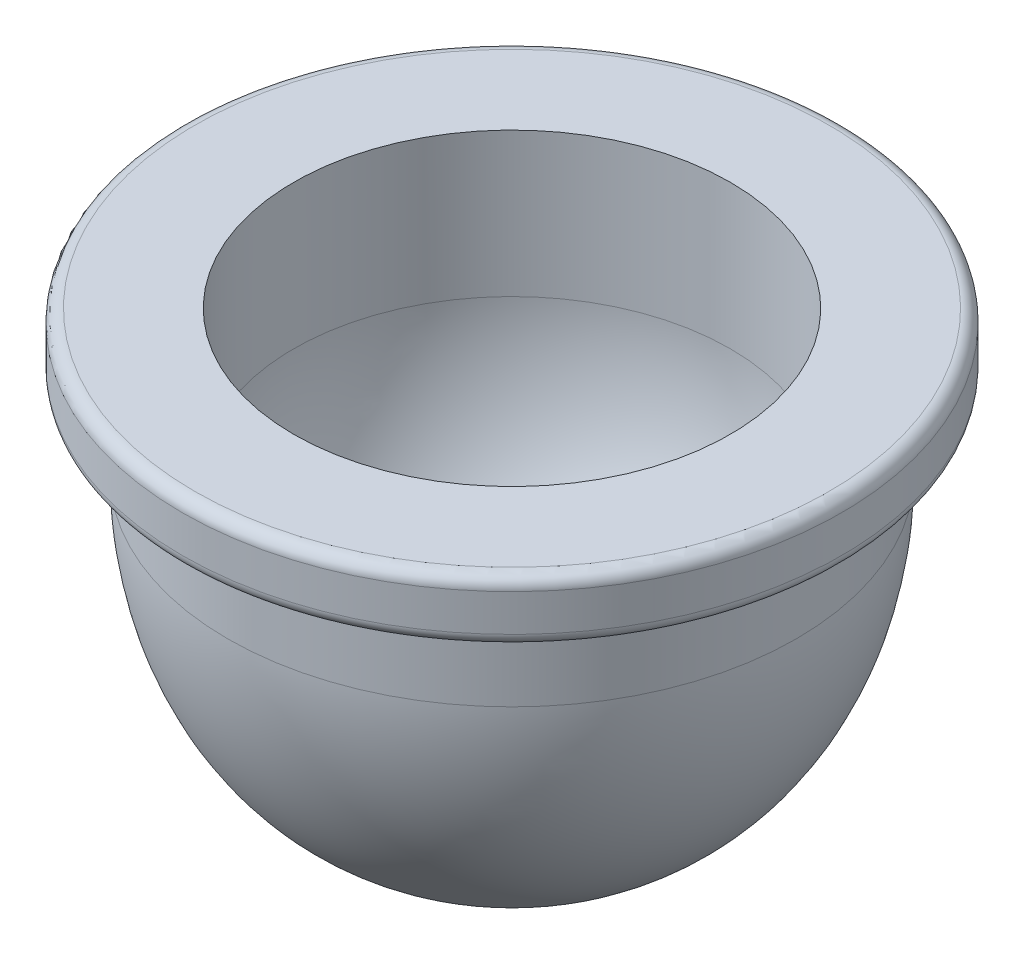
ISO-10303-21;
HEADER;
FILE_DESCRIPTION(('STEP AP214'),'2;1');
FILE_NAME('part.step','',(''),(''),'','','');
FILE_SCHEMA(('AUTOMOTIVE_DESIGN { 1 0 10303 214 1 1 1 1 }'));
ENDSEC;
DATA;
#1=APPLICATION_CONTEXT('core data for automotive mechanical design processes');
#2=APPLICATION_PROTOCOL_DEFINITION('international standard','automotive_design',2000,#1);
#3=PRODUCT_CONTEXT('',#1,'mechanical');
#4=PRODUCT('Part','Part','',(#3));
#5=PRODUCT_RELATED_PRODUCT_CATEGORY('part','',(#4));
#6=PRODUCT_DEFINITION_FORMATION('','',#4);
#7=PRODUCT_DEFINITION_CONTEXT('part definition',#1,'design');
#8=PRODUCT_DEFINITION('design','',#6,#7);
#9=PRODUCT_DEFINITION_SHAPE('','',#8);
#10=(LENGTH_UNIT() NAMED_UNIT(*) SI_UNIT(.MILLI.,.METRE.));
#11=(NAMED_UNIT(*) PLANE_ANGLE_UNIT() SI_UNIT($,.RADIAN.));
#12=(NAMED_UNIT(*) SI_UNIT($,.STERADIAN.) SOLID_ANGLE_UNIT());
#13=UNCERTAINTY_MEASURE_WITH_UNIT(LENGTH_MEASURE(1.E-05),#10,'distance_accuracy_value','');
#14=(GEOMETRIC_REPRESENTATION_CONTEXT(3) GLOBAL_UNCERTAINTY_ASSIGNED_CONTEXT((#13)) GLOBAL_UNIT_ASSIGNED_CONTEXT((#10,
#11,#12)) REPRESENTATION_CONTEXT('',''));
#15=CARTESIAN_POINT('',(0.,0.,0.));
#16=DIRECTION('',(0.,0.,1.));
#17=DIRECTION('',(1.,0.,0.));
#18=AXIS2_PLACEMENT_3D('',#15,#16,#17);
#19=CARTESIAN_POINT('',(0.,0.,0.));
#20=CARTESIAN_POINT('',(4.87128571293801,0.,0.));
#21=CARTESIAN_POINT('',(6.9,4.10294244970739,0.));
#22=CARTESIAN_POINT('',(6.9,7.5,0.));
#23=B_SPLINE_CURVE_WITH_KNOTS('',3,(#19,#20,#21,#22),.UNSPECIFIED.,.F.,.F.,(4,4),(0.,1.),.UNSPECIFIED.);
#24=CARTESIAN_POINT('',(0.,0.,0.));
#25=DIRECTION('',(0.,-1.,0.));
#26=AXIS1_PLACEMENT('',#24,#25);
#27=SURFACE_OF_REVOLUTION('',#23,#26);
#28=CARTESIAN_POINT('',(0.,7.5,0.));
#29=DIRECTION('',(0.,-1.,0.));
#30=DIRECTION('',(0.,0.,-1.));
#31=AXIS2_PLACEMENT_3D('',#28,#29,#30);
#32=CIRCLE('',#31,6.9);
#33=CARTESIAN_POINT('',(0.,7.5,-6.9));
#34=VERTEX_POINT('',#33);
#35=EDGE_CURVE('E70',#34,#34,#32,.T.);
#36=ORIENTED_EDGE('',*,*,#35,.T.);
#37=EDGE_LOOP('',(#36));
#38=FACE_BOUND('',#37,.T.);
#39=CARTESIAN_POINT('',(0.,0.,0.));
#40=VERTEX_POINT('',#39);
#41=VERTEX_LOOP('',#40);
#42=FACE_BOUND('',#41,.T.);
#43=ADVANCED_FACE('F33',(#38,#42),#27,.F.);
#44=CARTESIAN_POINT('',(0.,0.,0.));
#45=DIRECTION('',(0.,-1.,0.));
#46=DIRECTION('',(0.,0.,-1.));
#47=AXIS2_PLACEMENT_3D('',#44,#45,#46);
#48=CYLINDRICAL_SURFACE('',#47,6.9);
#49=CARTESIAN_POINT('',(0.,9.5,0.));
#50=DIRECTION('',(0.,-1.,0.));
#51=DIRECTION('',(0.,0.,-1.));
#52=AXIS2_PLACEMENT_3D('',#49,#50,#51);
#53=CIRCLE('',#52,6.9);
#54=CARTESIAN_POINT('',(0.,9.5,-6.9));
#55=VERTEX_POINT('',#54);
#56=EDGE_CURVE('E60',#55,#55,#53,.T.);
#57=ORIENTED_EDGE('',*,*,#56,.T.);
#58=EDGE_LOOP('',(#57));
#59=FACE_BOUND('',#58,.T.);
#60=ORIENTED_EDGE('',*,*,#35,.F.);
#61=EDGE_LOOP('',(#60));
#62=FACE_BOUND('',#61,.T.);
#63=ADVANCED_FACE('F91',(#59,#62),#48,.T.);
#64=CARTESIAN_POINT('',(6.9,9.5,0.));
#65=DIRECTION('',(0.,-1.,0.));
#66=DIRECTION('',(0.,0.,-1.));
#67=AXIS2_PLACEMENT_3D('',#64,#65,#66);
#68=PLANE('',#67);
#69=CARTESIAN_POINT('',(0.,9.5,0.));
#70=DIRECTION('',(0.,-1.,0.));
#71=DIRECTION('',(0.,0.,-1.));
#72=AXIS2_PLACEMENT_3D('',#69,#70,#71);
#73=CIRCLE('',#72,7.7);
#74=CARTESIAN_POINT('',(0.,9.5,-7.7));
#75=VERTEX_POINT('',#74);
#76=EDGE_CURVE('E73',#75,#75,#73,.T.);
#77=ORIENTED_EDGE('',*,*,#76,.T.);
#78=EDGE_LOOP('',(#77));
#79=FACE_BOUND('',#78,.T.);
#80=ORIENTED_EDGE('',*,*,#56,.F.);
#81=EDGE_LOOP('',(#80));
#82=FACE_BOUND('',#81,.T.);
#83=ADVANCED_FACE('F88',(#79,#82),#68,.T.);
#84=CARTESIAN_POINT('',(0.,0.,0.));
#85=DIRECTION('',(0.,-1.,0.));
#86=DIRECTION('',(0.,0.,-1.));
#87=AXIS2_PLACEMENT_3D('',#84,#85,#86);
#88=CYLINDRICAL_SURFACE('',#87,8.);
#89=CARTESIAN_POINT('',(0.,9.8,0.));
#90=DIRECTION('',(0.,-1.,0.));
#91=DIRECTION('',(0.,0.,-1.));
#92=AXIS2_PLACEMENT_3D('',#89,#90,#91);
#93=CIRCLE('',#92,8.);
#94=CARTESIAN_POINT('',(0.,9.8,-8.));
#95=VERTEX_POINT('',#94);
#96=EDGE_CURVE('E41',#95,#95,#93,.F.);
#97=ORIENTED_EDGE('',*,*,#96,.T.);
#98=EDGE_LOOP('',(#97));
#99=FACE_BOUND('',#98,.T.);
#100=CARTESIAN_POINT('',(0.,10.7,0.));
#101=DIRECTION('',(0.,1.,0.));
#102=DIRECTION('',(0.,0.,1.));
#103=AXIS2_PLACEMENT_3D('',#100,#101,#102);
#104=CIRCLE('',#103,8.);
#105=CARTESIAN_POINT('',(0.,10.7,8.));
#106=VERTEX_POINT('',#105);
#107=EDGE_CURVE('E76',#106,#106,#104,.F.);
#108=ORIENTED_EDGE('',*,*,#107,.T.);
#109=EDGE_LOOP('',(#108));
#110=FACE_BOUND('',#109,.T.);
#111=ADVANCED_FACE('F81',(#99,#110),#88,.T.);
#112=CARTESIAN_POINT('',(5.3,11.,0.));
#113=DIRECTION('',(0.,1.,0.));
#114=DIRECTION('',(0.,0.,1.));
#115=AXIS2_PLACEMENT_3D('',#112,#113,#114);
#116=PLANE('',#115);
#117=CARTESIAN_POINT('',(0.,11.,0.));
#118=DIRECTION('',(0.,1.,0.));
#119=DIRECTION('',(0.,0.,1.));
#120=AXIS2_PLACEMENT_3D('',#117,#118,#119);
#121=CIRCLE('',#120,7.7);
#122=CARTESIAN_POINT('',(0.,11.,7.7));
#123=VERTEX_POINT('',#122);
#124=EDGE_CURVE('E11',#123,#123,#121,.T.);
#125=ORIENTED_EDGE('',*,*,#124,.T.);
#126=EDGE_LOOP('',(#125));
#127=FACE_BOUND('',#126,.T.);
#128=CARTESIAN_POINT('',(0.,11.,0.));
#129=DIRECTION('',(0.,-1.,0.));
#130=DIRECTION('',(0.,0.,-1.));
#131=AXIS2_PLACEMENT_3D('',#128,#129,#130);
#132=CIRCLE('',#131,5.3);
#133=CARTESIAN_POINT('',(0.,11.,-5.3));
#134=VERTEX_POINT('',#133);
#135=EDGE_CURVE('E57',#134,#134,#132,.T.);
#136=ORIENTED_EDGE('',*,*,#135,.T.);
#137=EDGE_LOOP('',(#136));
#138=FACE_BOUND('',#137,.T.);
#139=ADVANCED_FACE('F113',(#127,#138),#116,.T.);
#140=CARTESIAN_POINT('',(0.,0.,0.));
#141=DIRECTION('',(0.,-1.,0.));
#142=DIRECTION('',(0.,0.,-1.));
#143=AXIS2_PLACEMENT_3D('',#140,#141,#142);
#144=CYLINDRICAL_SURFACE('',#143,5.3);
#145=CARTESIAN_POINT('',(0.,7.5,0.));
#146=DIRECTION('',(0.,-1.,0.));
#147=DIRECTION('',(0.,0.,-1.));
#148=AXIS2_PLACEMENT_3D('',#145,#146,#147);
#149=CIRCLE('',#148,5.3);
#150=CARTESIAN_POINT('',(0.,7.5,-5.3));
#151=VERTEX_POINT('',#150);
#152=EDGE_CURVE('E55',#151,#151,#149,.T.);
#153=ORIENTED_EDGE('',*,*,#152,.T.);
#154=EDGE_LOOP('',(#153));
#155=FACE_BOUND('',#154,.T.);
#156=ORIENTED_EDGE('',*,*,#135,.F.);
#157=EDGE_LOOP('',(#156));
#158=FACE_BOUND('',#157,.T.);
#159=ADVANCED_FACE('F51',(#155,#158),#144,.F.);
#160=CARTESIAN_POINT('',(5.3,7.5,0.));
#161=CARTESIAN_POINT('',(5.3,7.14488140107617,0.));
#162=CARTESIAN_POINT('',(5.24816131958337,6.44351985379125,0.));
#163=CARTESIAN_POINT('',(4.92475328311779,4.99343819872966,0.));
#164=CARTESIAN_POINT('',(4.27169096771349,3.67692120271486,0.));
#165=CARTESIAN_POINT('',(3.31948840256839,2.67264515097446,0.));
#166=CARTESIAN_POINT('',(2.45150538936199,2.09358415576244,0.));
#167=CARTESIAN_POINT('',(1.55814841513485,1.76895123705778,0.));
#168=CARTESIAN_POINT('',(0.724232404400004,1.62609705400189,0.));
#169=CARTESIAN_POINT('',(0.235783561524869,1.6,0.));
#170=CARTESIAN_POINT('',(0.,1.6,0.));
#171=B_SPLINE_CURVE_WITH_KNOTS('',3,(#160,#161,#162,#163,#164,#165,#166,#167,#168,#169,#170),
.UNSPECIFIED.,.F.,.F.,(4,1,1,1,1,1,1,1,4),(0.,0.125,0.25,0.5,0.625,0.75,0.875,0.9375,1.),.UNSPECIFIED.);
#172=CARTESIAN_POINT('',(0.,0.,0.));
#173=DIRECTION('',(0.,-1.,0.));
#174=AXIS1_PLACEMENT('',#172,#173);
#175=SURFACE_OF_REVOLUTION('',#171,#174);
#176=CARTESIAN_POINT('',(0.,1.6,0.));
#177=VERTEX_POINT('',#176);
#178=VERTEX_LOOP('',#177);
#179=FACE_BOUND('',#178,.T.);
#180=ORIENTED_EDGE('',*,*,#152,.F.);
#181=EDGE_LOOP('',(#180));
#182=FACE_BOUND('',#181,.T.);
#183=ADVANCED_FACE('F47',(#179,#182),#175,.F.);
#184=CARTESIAN_POINT('',(0.,9.8,0.));
#185=DIRECTION('',(0.,-1.,0.));
#186=DIRECTION('',(0.,0.,-1.));
#187=AXIS2_PLACEMENT_3D('',#184,#185,#186);
#188=TOROIDAL_SURFACE('',#187,7.7,0.3);
#189=ORIENTED_EDGE('',*,*,#96,.F.);
#190=EDGE_LOOP('',(#189));
#191=FACE_BOUND('',#190,.T.);
#192=ORIENTED_EDGE('',*,*,#76,.F.);
#193=EDGE_LOOP('',(#192));
#194=FACE_BOUND('',#193,.T.);
#195=ADVANCED_FACE('F50',(#191,#194),#188,.T.);
#196=CARTESIAN_POINT('',(0.,10.7,0.));
#197=DIRECTION('',(0.,1.,0.));
#198=DIRECTION('',(0.,0.,1.));
#199=AXIS2_PLACEMENT_3D('',#196,#197,#198);
#200=TOROIDAL_SURFACE('',#199,7.7,0.3);
#201=ORIENTED_EDGE('',*,*,#124,.F.);
#202=EDGE_LOOP('',(#201));
#203=FACE_BOUND('',#202,.T.);
#204=ORIENTED_EDGE('',*,*,#107,.F.);
#205=EDGE_LOOP('',(#204));
#206=FACE_BOUND('',#205,.T.);
#207=ADVANCED_FACE('F35',(#203,#206),#200,.T.);
#208=CLOSED_SHELL('',(#43,#63,#83,#111,#139,#159,#183,#195,#207));
#209=MANIFOLD_SOLID_BREP('B2',#208);
#210=ADVANCED_BREP_SHAPE_REPRESENTATION('',(#18,#209),#14);
#211=SHAPE_DEFINITION_REPRESENTATION(#9,#210);
ENDSEC;
END-ISO-10303-21;
